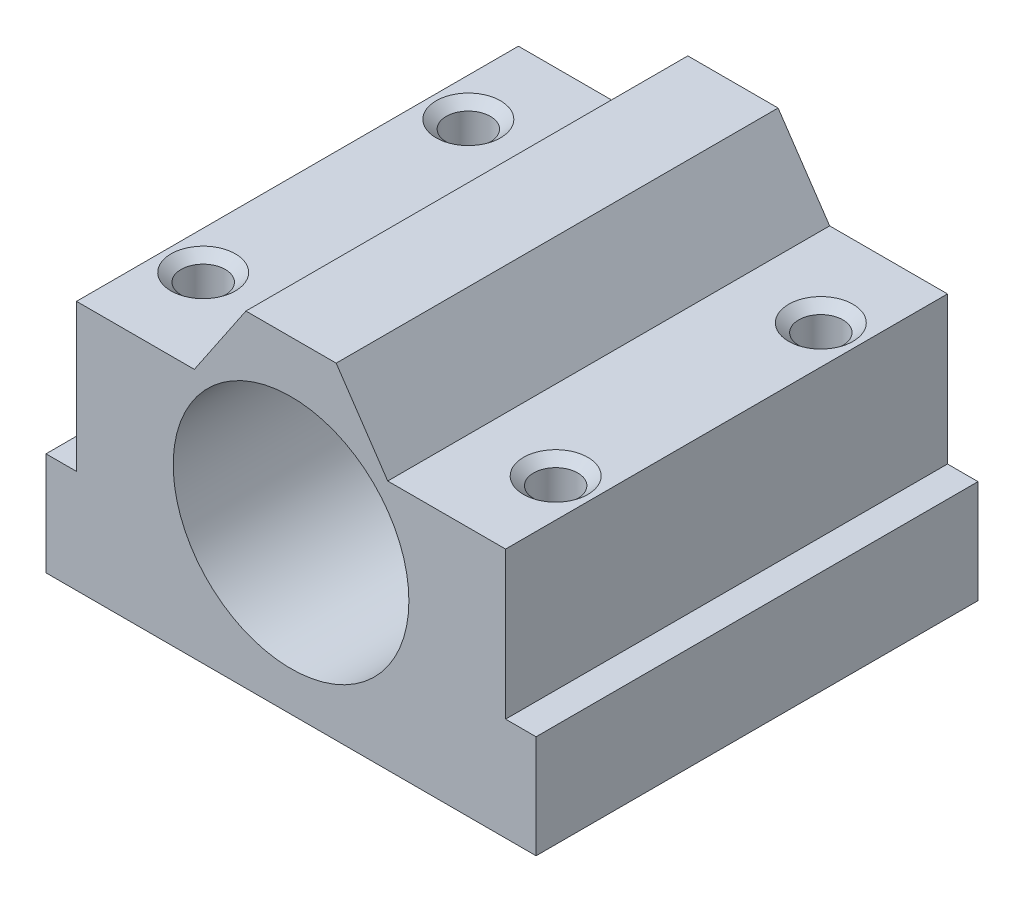
ISO-10303-21;
HEADER;
FILE_DESCRIPTION(('STEP AP214'),'2;1');
FILE_NAME('part.step','',(''),(''),'','','');
FILE_SCHEMA(('AUTOMOTIVE_DESIGN { 1 0 10303 214 1 1 1 1 }'));
ENDSEC;
DATA;
#1=APPLICATION_CONTEXT('core data for automotive mechanical design processes');
#2=APPLICATION_PROTOCOL_DEFINITION('international standard','automotive_design',2000,#1);
#3=PRODUCT_CONTEXT('',#1,'mechanical');
#4=PRODUCT('Part','Part','',(#3));
#5=PRODUCT_RELATED_PRODUCT_CATEGORY('part','',(#4));
#6=PRODUCT_DEFINITION_FORMATION('','',#4);
#7=PRODUCT_DEFINITION_CONTEXT('part definition',#1,'design');
#8=PRODUCT_DEFINITION('design','',#6,#7);
#9=PRODUCT_DEFINITION_SHAPE('','',#8);
#10=(LENGTH_UNIT() NAMED_UNIT(*) SI_UNIT(.MILLI.,.METRE.));
#11=(NAMED_UNIT(*) PLANE_ANGLE_UNIT() SI_UNIT($,.RADIAN.));
#12=(NAMED_UNIT(*) SI_UNIT($,.STERADIAN.) SOLID_ANGLE_UNIT());
#13=UNCERTAINTY_MEASURE_WITH_UNIT(LENGTH_MEASURE(1.E-05),#10,'distance_accuracy_value','');
#14=(GEOMETRIC_REPRESENTATION_CONTEXT(3) GLOBAL_UNCERTAINTY_ASSIGNED_CONTEXT((#13)) GLOBAL_UNIT_ASSIGNED_CONTEXT((#10,
#11,#12)) REPRESENTATION_CONTEXT('',''));
#15=CARTESIAN_POINT('',(0.,0.,0.));
#16=DIRECTION('',(0.,0.,1.));
#17=DIRECTION('',(1.,0.,0.));
#18=AXIS2_PLACEMENT_3D('',#15,#16,#17);
#19=CARTESIAN_POINT('',(0.,0.,30.));
#20=DIRECTION('',(0.,0.,1.));
#21=DIRECTION('',(1.,0.,0.));
#22=AXIS2_PLACEMENT_3D('',#19,#20,#21);
#23=PLANE('',#22);
#24=DIRECTION('',(1.,0.,0.));
#25=VECTOR('',#24,1.);
#26=CARTESIAN_POINT('',(0.,0.,30.));
#27=LINE('',#26,#25);
#28=CARTESIAN_POINT('',(0.,0.,30.));
#29=VERTEX_POINT('',#28);
#30=CARTESIAN_POINT('',(33.27,0.,30.));
#31=VERTEX_POINT('',#30);
#32=EDGE_CURVE('E186',#29,#31,#27,.T.);
#33=ORIENTED_EDGE('',*,*,#32,.T.);
#34=DIRECTION('',(0.,1.,0.));
#35=VECTOR('',#34,1.);
#36=CARTESIAN_POINT('',(33.27,0.,30.));
#37=LINE('',#36,#35);
#38=CARTESIAN_POINT('',(33.27,7.,30.));
#39=VERTEX_POINT('',#38);
#40=EDGE_CURVE('E114',#31,#39,#37,.T.);
#41=ORIENTED_EDGE('',*,*,#40,.T.);
#42=DIRECTION('',(-1.,0.,0.));
#43=VECTOR('',#42,1.);
#44=CARTESIAN_POINT('',(33.27,7.,30.));
#45=LINE('',#44,#43);
#46=CARTESIAN_POINT('',(31.1993641202158,7.,30.));
#47=VERTEX_POINT('',#46);
#48=EDGE_CURVE('E253',#39,#47,#45,.T.);
#49=ORIENTED_EDGE('',*,*,#48,.T.);
#50=DIRECTION('',(0.,1.,0.));
#51=VECTOR('',#50,1.);
#52=CARTESIAN_POINT('',(31.1993641202158,7.,30.));
#53=LINE('',#52,#51);
#54=CARTESIAN_POINT('',(31.1993641202158,17.,30.));
#55=VERTEX_POINT('',#54);
#56=EDGE_CURVE('E255',#47,#55,#53,.T.);
#57=ORIENTED_EDGE('',*,*,#56,.T.);
#58=DIRECTION('',(-1.,0.,0.));
#59=VECTOR('',#58,1.);
#60=CARTESIAN_POINT('',(31.1993641202158,17.,30.));
#61=LINE('',#60,#59);
#62=CARTESIAN_POINT('',(23.1993641202158,17.,30.));
#63=VERTEX_POINT('',#62);
#64=EDGE_CURVE('E257',#55,#63,#61,.T.);
#65=ORIENTED_EDGE('',*,*,#64,.T.);
#66=DIRECTION('',(-0.559857411277987,0.82858896869142,0.));
#67=VECTOR('',#66,1.);
#68=CARTESIAN_POINT('',(23.1993641202158,17.,30.));
#69=LINE('',#68,#67);
#70=CARTESIAN_POINT('',(19.6993641202158,22.18,30.));
#71=VERTEX_POINT('',#70);
#72=EDGE_CURVE('E259',#63,#71,#69,.T.);
#73=ORIENTED_EDGE('',*,*,#72,.T.);
#74=DIRECTION('',(-1.,0.,0.));
#75=VECTOR('',#74,1.);
#76=CARTESIAN_POINT('',(13.5706358797842,22.18,30.));
#77=LINE('',#76,#75);
#78=CARTESIAN_POINT('',(13.5706358797842,22.18,30.));
#79=VERTEX_POINT('',#78);
#80=EDGE_CURVE('E261',#71,#79,#77,.T.);
#81=ORIENTED_EDGE('',*,*,#80,.T.);
#82=DIRECTION('',(-0.559857411277987,-0.82858896869142,0.));
#83=VECTOR('',#82,1.);
#84=CARTESIAN_POINT('',(10.0706358797842,17.,30.));
#85=LINE('',#84,#83);
#86=CARTESIAN_POINT('',(10.0706358797842,17.,30.));
#87=VERTEX_POINT('',#86);
#88=EDGE_CURVE('E263',#79,#87,#85,.T.);
#89=ORIENTED_EDGE('',*,*,#88,.T.);
#90=DIRECTION('',(-1.,0.,0.));
#91=VECTOR('',#90,1.);
#92=CARTESIAN_POINT('',(2.0706358797842,17.,30.));
#93=LINE('',#92,#91);
#94=CARTESIAN_POINT('',(2.0706358797842,17.,30.));
#95=VERTEX_POINT('',#94);
#96=EDGE_CURVE('E145',#87,#95,#93,.T.);
#97=ORIENTED_EDGE('',*,*,#96,.T.);
#98=DIRECTION('',(0.,-1.,0.));
#99=VECTOR('',#98,1.);
#100=CARTESIAN_POINT('',(2.0706358797842,7.,30.));
#101=LINE('',#100,#99);
#102=CARTESIAN_POINT('',(2.0706358797842,7.,30.));
#103=VERTEX_POINT('',#102);
#104=EDGE_CURVE('E139',#95,#103,#101,.T.);
#105=ORIENTED_EDGE('',*,*,#104,.T.);
#106=DIRECTION('',(-1.,0.,0.));
#107=VECTOR('',#106,1.);
#108=CARTESIAN_POINT('',(0.,7.,30.));
#109=LINE('',#108,#107);
#110=CARTESIAN_POINT('',(0.,7.,30.));
#111=VERTEX_POINT('',#110);
#112=EDGE_CURVE('E143',#103,#111,#109,.T.);
#113=ORIENTED_EDGE('',*,*,#112,.T.);
#114=DIRECTION('',(0.,-1.,0.));
#115=VECTOR('',#114,1.);
#116=CARTESIAN_POINT('',(0.,0.,30.));
#117=LINE('',#116,#115);
#118=EDGE_CURVE('E59',#111,#29,#117,.T.);
#119=ORIENTED_EDGE('',*,*,#118,.T.);
#120=EDGE_LOOP('',(#33,#41,#49,#57,#65,#73,#81,#89,#97,#105,#113,#119));
#121=FACE_BOUND('',#120,.T.);
#122=CARTESIAN_POINT('',(16.635,10.68,30.));
#123=DIRECTION('',(0.,0.,1.));
#124=DIRECTION('',(1.,0.,0.));
#125=AXIS2_PLACEMENT_3D('',#122,#123,#124);
#126=CIRCLE('',#125,8.);
#127=CARTESIAN_POINT('',(24.635,10.68,30.));
#128=VERTEX_POINT('',#127);
#129=EDGE_CURVE('E167',#128,#128,#126,.T.);
#130=ORIENTED_EDGE('',*,*,#129,.F.);
#131=EDGE_LOOP('',(#130));
#132=FACE_BOUND('',#131,.T.);
#133=ADVANCED_FACE('F40',(#121,#132),#23,.T.);
#134=CARTESIAN_POINT('',(0.,0.,0.));
#135=DIRECTION('',(0.,0.,1.));
#136=DIRECTION('',(1.,0.,0.));
#137=AXIS2_PLACEMENT_3D('',#134,#135,#136);
#138=PLANE('',#137);
#139=DIRECTION('',(1.,0.,0.));
#140=VECTOR('',#139,1.);
#141=CARTESIAN_POINT('',(0.,0.,0.));
#142=LINE('',#141,#140);
#143=CARTESIAN_POINT('',(0.,0.,0.));
#144=VERTEX_POINT('',#143);
#145=CARTESIAN_POINT('',(33.27,0.,0.));
#146=VERTEX_POINT('',#145);
#147=EDGE_CURVE('E163',#144,#146,#142,.T.);
#148=ORIENTED_EDGE('',*,*,#147,.F.);
#149=DIRECTION('',(0.,-1.,0.));
#150=VECTOR('',#149,1.);
#151=CARTESIAN_POINT('',(0.,0.,0.));
#152=LINE('',#151,#150);
#153=CARTESIAN_POINT('',(0.,7.,0.));
#154=VERTEX_POINT('',#153);
#155=EDGE_CURVE('E106',#154,#144,#152,.T.);
#156=ORIENTED_EDGE('',*,*,#155,.F.);
#157=DIRECTION('',(-1.,0.,0.));
#158=VECTOR('',#157,1.);
#159=CARTESIAN_POINT('',(0.,7.,0.));
#160=LINE('',#159,#158);
#161=CARTESIAN_POINT('',(2.0706358797842,7.,0.));
#162=VERTEX_POINT('',#161);
#163=EDGE_CURVE('E100',#162,#154,#160,.T.);
#164=ORIENTED_EDGE('',*,*,#163,.F.);
#165=DIRECTION('',(0.,-1.,0.));
#166=VECTOR('',#165,1.);
#167=CARTESIAN_POINT('',(2.0706358797842,7.,0.));
#168=LINE('',#167,#166);
#169=CARTESIAN_POINT('',(2.0706358797842,17.,0.));
#170=VERTEX_POINT('',#169);
#171=EDGE_CURVE('E153',#170,#162,#168,.T.);
#172=ORIENTED_EDGE('',*,*,#171,.F.);
#173=DIRECTION('',(-1.,0.,0.));
#174=VECTOR('',#173,1.);
#175=CARTESIAN_POINT('',(2.0706358797842,17.,0.));
#176=LINE('',#175,#174);
#177=CARTESIAN_POINT('',(10.0706358797842,17.,0.));
#178=VERTEX_POINT('',#177);
#179=EDGE_CURVE('E181',#178,#170,#176,.T.);
#180=ORIENTED_EDGE('',*,*,#179,.F.);
#181=DIRECTION('',(-0.559857411277987,-0.82858896869142,0.));
#182=VECTOR('',#181,1.);
#183=CARTESIAN_POINT('',(10.0706358797842,17.,0.));
#184=LINE('',#183,#182);
#185=CARTESIAN_POINT('',(13.5706358797842,22.18,0.));
#186=VERTEX_POINT('',#185);
#187=EDGE_CURVE('E179',#186,#178,#184,.T.);
#188=ORIENTED_EDGE('',*,*,#187,.F.);
#189=DIRECTION('',(-1.,0.,0.));
#190=VECTOR('',#189,1.);
#191=CARTESIAN_POINT('',(13.5706358797842,22.18,0.));
#192=LINE('',#191,#190);
#193=CARTESIAN_POINT('',(19.6993641202158,22.18,0.));
#194=VERTEX_POINT('',#193);
#195=EDGE_CURVE('E177',#194,#186,#192,.T.);
#196=ORIENTED_EDGE('',*,*,#195,.F.);
#197=DIRECTION('',(-0.559857411277987,0.82858896869142,0.));
#198=VECTOR('',#197,1.);
#199=CARTESIAN_POINT('',(23.1993641202158,17.,0.));
#200=LINE('',#199,#198);
#201=CARTESIAN_POINT('',(23.1993641202158,17.,0.));
#202=VERTEX_POINT('',#201);
#203=EDGE_CURVE('E175',#202,#194,#200,.T.);
#204=ORIENTED_EDGE('',*,*,#203,.F.);
#205=DIRECTION('',(-1.,0.,0.));
#206=VECTOR('',#205,1.);
#207=CARTESIAN_POINT('',(31.1993641202158,17.,0.));
#208=LINE('',#207,#206);
#209=CARTESIAN_POINT('',(31.1993641202158,17.,0.));
#210=VERTEX_POINT('',#209);
#211=EDGE_CURVE('E173',#210,#202,#208,.T.);
#212=ORIENTED_EDGE('',*,*,#211,.F.);
#213=DIRECTION('',(0.,1.,0.));
#214=VECTOR('',#213,1.);
#215=CARTESIAN_POINT('',(31.1993641202158,7.,0.));
#216=LINE('',#215,#214);
#217=CARTESIAN_POINT('',(31.1993641202158,7.,0.));
#218=VERTEX_POINT('',#217);
#219=EDGE_CURVE('E171',#218,#210,#216,.T.);
#220=ORIENTED_EDGE('',*,*,#219,.F.);
#221=DIRECTION('',(-1.,0.,0.));
#222=VECTOR('',#221,1.);
#223=CARTESIAN_POINT('',(33.27,7.,0.));
#224=LINE('',#223,#222);
#225=CARTESIAN_POINT('',(33.27,7.,0.));
#226=VERTEX_POINT('',#225);
#227=EDGE_CURVE('E169',#226,#218,#224,.T.);
#228=ORIENTED_EDGE('',*,*,#227,.F.);
#229=DIRECTION('',(0.,1.,0.));
#230=VECTOR('',#229,1.);
#231=CARTESIAN_POINT('',(33.27,0.,0.));
#232=LINE('',#231,#230);
#233=EDGE_CURVE('E166',#146,#226,#232,.T.);
#234=ORIENTED_EDGE('',*,*,#233,.F.);
#235=EDGE_LOOP('',(#148,#156,#164,#172,#180,#188,#196,#204,#212,#220,#228,#234));
#236=FACE_BOUND('',#235,.T.);
#237=CARTESIAN_POINT('',(16.635,10.68,0.));
#238=DIRECTION('',(0.,0.,1.));
#239=DIRECTION('',(1.,0.,0.));
#240=AXIS2_PLACEMENT_3D('',#237,#238,#239);
#241=CIRCLE('',#240,8.);
#242=CARTESIAN_POINT('',(24.635,10.68,0.));
#243=VERTEX_POINT('',#242);
#244=EDGE_CURVE('E246',#243,#243,#241,.T.);
#245=ORIENTED_EDGE('',*,*,#244,.T.);
#246=EDGE_LOOP('',(#245));
#247=FACE_BOUND('',#246,.T.);
#248=ADVANCED_FACE('F276',(#236,#247),#138,.F.);
#249=CARTESIAN_POINT('',(0.,0.,30.));
#250=DIRECTION('',(0.,1.,0.));
#251=DIRECTION('',(0.,0.,1.));
#252=AXIS2_PLACEMENT_3D('',#249,#250,#251);
#253=PLANE('',#252);
#254=CARTESIAN_POINT('',(4.67063587978421,0.,6.));
#255=DIRECTION('',(0.,1.,0.));
#256=DIRECTION('',(0.,0.,1.));
#257=AXIS2_PLACEMENT_3D('',#254,#255,#256);
#258=CIRCLE('',#257,1.5);
#259=CARTESIAN_POINT('',(4.67063587978421,0.,7.5));
#260=VERTEX_POINT('',#259);
#261=EDGE_CURVE('E237',#260,#260,#258,.T.);
#262=ORIENTED_EDGE('',*,*,#261,.T.);
#263=EDGE_LOOP('',(#262));
#264=FACE_BOUND('',#263,.T.);
#265=CARTESIAN_POINT('',(4.67063587978422,0.,24.));
#266=DIRECTION('',(0.,1.,0.));
#267=DIRECTION('',(0.,0.,1.));
#268=AXIS2_PLACEMENT_3D('',#265,#266,#267);
#269=CIRCLE('',#268,1.5);
#270=CARTESIAN_POINT('',(4.67063587978422,0.,25.5));
#271=VERTEX_POINT('',#270);
#272=EDGE_CURVE('E213',#271,#271,#269,.T.);
#273=ORIENTED_EDGE('',*,*,#272,.T.);
#274=EDGE_LOOP('',(#273));
#275=FACE_BOUND('',#274,.T.);
#276=CARTESIAN_POINT('',(28.5993641202158,0.,24.));
#277=DIRECTION('',(0.,1.,0.));
#278=DIRECTION('',(0.,0.,1.));
#279=AXIS2_PLACEMENT_3D('',#276,#277,#278);
#280=CIRCLE('',#279,1.5);
#281=CARTESIAN_POINT('',(28.5993641202158,0.,25.5));
#282=VERTEX_POINT('',#281);
#283=EDGE_CURVE('E243',#282,#282,#280,.T.);
#284=ORIENTED_EDGE('',*,*,#283,.T.);
#285=EDGE_LOOP('',(#284));
#286=FACE_BOUND('',#285,.T.);
#287=CARTESIAN_POINT('',(28.5993641202158,0.,6.));
#288=DIRECTION('',(0.,1.,0.));
#289=DIRECTION('',(0.,0.,1.));
#290=AXIS2_PLACEMENT_3D('',#287,#288,#289);
#291=CIRCLE('',#290,1.5);
#292=CARTESIAN_POINT('',(28.5993641202158,0.,7.5));
#293=VERTEX_POINT('',#292);
#294=EDGE_CURVE('E240',#293,#293,#291,.T.);
#295=ORIENTED_EDGE('',*,*,#294,.T.);
#296=EDGE_LOOP('',(#295));
#297=FACE_BOUND('',#296,.T.);
#298=ORIENTED_EDGE('',*,*,#147,.T.);
#299=DIRECTION('',(0.,0.,-1.));
#300=VECTOR('',#299,1.);
#301=CARTESIAN_POINT('',(33.27,0.,30.));
#302=LINE('',#301,#300);
#303=EDGE_CURVE('E11',#31,#146,#302,.T.);
#304=ORIENTED_EDGE('',*,*,#303,.F.);
#305=ORIENTED_EDGE('',*,*,#32,.F.);
#306=DIRECTION('',(0.,0.,-1.));
#307=VECTOR('',#306,1.);
#308=CARTESIAN_POINT('',(0.,0.,30.));
#309=LINE('',#308,#307);
#310=EDGE_CURVE('E159',#29,#144,#309,.T.);
#311=ORIENTED_EDGE('',*,*,#310,.T.);
#312=EDGE_LOOP('',(#298,#304,#305,#311));
#313=FACE_BOUND('',#312,.T.);
#314=ADVANCED_FACE('F42',(#264,#275,#286,#297,#313),#253,.F.);
#315=CARTESIAN_POINT('',(33.27,0.,30.));
#316=DIRECTION('',(-1.,0.,0.));
#317=DIRECTION('',(0.,0.,1.));
#318=AXIS2_PLACEMENT_3D('',#315,#316,#317);
#319=PLANE('',#318);
#320=ORIENTED_EDGE('',*,*,#233,.T.);
#321=DIRECTION('',(0.,0.,-1.));
#322=VECTOR('',#321,1.);
#323=CARTESIAN_POINT('',(33.27,7.,30.));
#324=LINE('',#323,#322);
#325=EDGE_CURVE('E50',#39,#226,#324,.T.);
#326=ORIENTED_EDGE('',*,*,#325,.F.);
#327=ORIENTED_EDGE('',*,*,#40,.F.);
#328=ORIENTED_EDGE('',*,*,#303,.T.);
#329=EDGE_LOOP('',(#320,#326,#327,#328));
#330=FACE_BOUND('',#329,.T.);
#331=ADVANCED_FACE('F340',(#330),#319,.F.);
#332=CARTESIAN_POINT('',(33.27,7.,30.));
#333=DIRECTION('',(0.,-1.,0.));
#334=DIRECTION('',(0.,0.,-1.));
#335=AXIS2_PLACEMENT_3D('',#332,#333,#334);
#336=PLANE('',#335);
#337=ORIENTED_EDGE('',*,*,#227,.T.);
#338=DIRECTION('',(0.,0.,-1.));
#339=VECTOR('',#338,1.);
#340=CARTESIAN_POINT('',(31.1993641202158,7.,30.));
#341=LINE('',#340,#339);
#342=EDGE_CURVE('E205',#47,#218,#341,.T.);
#343=ORIENTED_EDGE('',*,*,#342,.F.);
#344=ORIENTED_EDGE('',*,*,#48,.F.);
#345=ORIENTED_EDGE('',*,*,#325,.T.);
#346=EDGE_LOOP('',(#337,#343,#344,#345));
#347=FACE_BOUND('',#346,.T.);
#348=ADVANCED_FACE('F347',(#347),#336,.F.);
#349=CARTESIAN_POINT('',(31.1993641202158,7.,30.));
#350=DIRECTION('',(-1.,0.,0.));
#351=DIRECTION('',(0.,0.,1.));
#352=AXIS2_PLACEMENT_3D('',#349,#350,#351);
#353=PLANE('',#352);
#354=ORIENTED_EDGE('',*,*,#219,.T.);
#355=DIRECTION('',(0.,0.,-1.));
#356=VECTOR('',#355,1.);
#357=CARTESIAN_POINT('',(31.1993641202158,17.,30.));
#358=LINE('',#357,#356);
#359=EDGE_CURVE('E202',#55,#210,#358,.T.);
#360=ORIENTED_EDGE('',*,*,#359,.F.);
#361=ORIENTED_EDGE('',*,*,#56,.F.);
#362=ORIENTED_EDGE('',*,*,#342,.T.);
#363=EDGE_LOOP('',(#354,#360,#361,#362));
#364=FACE_BOUND('',#363,.T.);
#365=ADVANCED_FACE('F356',(#364),#353,.F.);
#366=CARTESIAN_POINT('',(31.1993641202158,17.,30.));
#367=DIRECTION('',(0.,-1.,0.));
#368=DIRECTION('',(0.,0.,-1.));
#369=AXIS2_PLACEMENT_3D('',#366,#367,#368);
#370=PLANE('',#369);
#371=CARTESIAN_POINT('',(28.5993641202158,17.,24.));
#372=DIRECTION('',(0.,1.,0.));
#373=DIRECTION('',(0.,0.,1.));
#374=AXIS2_PLACEMENT_3D('',#371,#372,#373);
#375=CIRCLE('',#374,2.1844);
#376=CARTESIAN_POINT('',(28.5993641202158,17.,26.1844));
#377=VERTEX_POINT('',#376);
#378=EDGE_CURVE('E230',#377,#377,#375,.T.);
#379=ORIENTED_EDGE('',*,*,#378,.F.);
#380=EDGE_LOOP('',(#379));
#381=FACE_BOUND('',#380,.T.);
#382=CARTESIAN_POINT('',(28.5993641202158,17.,6.));
#383=DIRECTION('',(0.,1.,0.));
#384=DIRECTION('',(0.,0.,1.));
#385=AXIS2_PLACEMENT_3D('',#382,#383,#384);
#386=CIRCLE('',#385,2.1844);
#387=CARTESIAN_POINT('',(28.5993641202158,17.,8.1844));
#388=VERTEX_POINT('',#387);
#389=EDGE_CURVE('E220',#388,#388,#386,.T.);
#390=ORIENTED_EDGE('',*,*,#389,.F.);
#391=EDGE_LOOP('',(#390));
#392=FACE_BOUND('',#391,.T.);
#393=ORIENTED_EDGE('',*,*,#211,.T.);
#394=DIRECTION('',(0.,0.,-1.));
#395=VECTOR('',#394,1.);
#396=CARTESIAN_POINT('',(23.1993641202158,17.,30.));
#397=LINE('',#396,#395);
#398=EDGE_CURVE('E199',#63,#202,#397,.T.);
#399=ORIENTED_EDGE('',*,*,#398,.F.);
#400=ORIENTED_EDGE('',*,*,#64,.F.);
#401=ORIENTED_EDGE('',*,*,#359,.T.);
#402=EDGE_LOOP('',(#393,#399,#400,#401));
#403=FACE_BOUND('',#402,.T.);
#404=ADVANCED_FACE('F362',(#381,#392,#403),#370,.F.);
#405=CARTESIAN_POINT('',(23.1993641202158,17.,30.));
#406=DIRECTION('',(-0.82858896869142,-0.559857411277987,0.));
#407=DIRECTION('',(0.559857411277987,-0.82858896869142,0.));
#408=AXIS2_PLACEMENT_3D('',#405,#406,#407);
#409=PLANE('',#408);
#410=ORIENTED_EDGE('',*,*,#203,.T.);
#411=DIRECTION('',(0.,0.,-1.));
#412=VECTOR('',#411,1.);
#413=CARTESIAN_POINT('',(19.6993641202158,22.18,30.));
#414=LINE('',#413,#412);
#415=EDGE_CURVE('E196',#71,#194,#414,.T.);
#416=ORIENTED_EDGE('',*,*,#415,.F.);
#417=ORIENTED_EDGE('',*,*,#72,.F.);
#418=ORIENTED_EDGE('',*,*,#398,.T.);
#419=EDGE_LOOP('',(#410,#416,#417,#418));
#420=FACE_BOUND('',#419,.T.);
#421=ADVANCED_FACE('F366',(#420),#409,.F.);
#422=CARTESIAN_POINT('',(13.5706358797842,22.18,30.));
#423=DIRECTION('',(0.,-1.,0.));
#424=DIRECTION('',(0.,0.,-1.));
#425=AXIS2_PLACEMENT_3D('',#422,#423,#424);
#426=PLANE('',#425);
#427=ORIENTED_EDGE('',*,*,#195,.T.);
#428=DIRECTION('',(0.,0.,-1.));
#429=VECTOR('',#428,1.);
#430=CARTESIAN_POINT('',(13.5706358797842,22.18,30.));
#431=LINE('',#430,#429);
#432=EDGE_CURVE('E193',#79,#186,#431,.T.);
#433=ORIENTED_EDGE('',*,*,#432,.F.);
#434=ORIENTED_EDGE('',*,*,#80,.F.);
#435=ORIENTED_EDGE('',*,*,#415,.T.);
#436=EDGE_LOOP('',(#427,#433,#434,#435));
#437=FACE_BOUND('',#436,.T.);
#438=ADVANCED_FACE('F370',(#437),#426,.F.);
#439=CARTESIAN_POINT('',(10.0706358797842,17.,30.));
#440=DIRECTION('',(0.82858896869142,-0.559857411277987,0.));
#441=DIRECTION('',(0.559857411277987,0.82858896869142,0.));
#442=AXIS2_PLACEMENT_3D('',#439,#440,#441);
#443=PLANE('',#442);
#444=ORIENTED_EDGE('',*,*,#187,.T.);
#445=DIRECTION('',(0.,0.,-1.));
#446=VECTOR('',#445,1.);
#447=CARTESIAN_POINT('',(10.0706358797842,17.,30.));
#448=LINE('',#447,#446);
#449=EDGE_CURVE('E190',#87,#178,#448,.T.);
#450=ORIENTED_EDGE('',*,*,#449,.F.);
#451=ORIENTED_EDGE('',*,*,#88,.F.);
#452=ORIENTED_EDGE('',*,*,#432,.T.);
#453=EDGE_LOOP('',(#444,#450,#451,#452));
#454=FACE_BOUND('',#453,.T.);
#455=ADVANCED_FACE('F269',(#454),#443,.F.);
#456=CARTESIAN_POINT('',(2.0706358797842,17.,30.));
#457=DIRECTION('',(0.,-1.,0.));
#458=DIRECTION('',(0.,0.,-1.));
#459=AXIS2_PLACEMENT_3D('',#456,#457,#458);
#460=PLANE('',#459);
#461=CARTESIAN_POINT('',(4.67063587978422,17.,24.));
#462=DIRECTION('',(0.,1.,0.));
#463=DIRECTION('',(0.,0.,1.));
#464=AXIS2_PLACEMENT_3D('',#461,#462,#463);
#465=CIRCLE('',#464,2.1844);
#466=CARTESIAN_POINT('',(4.67063587978422,17.,26.1844));
#467=VERTEX_POINT('',#466);
#468=EDGE_CURVE('E217',#467,#467,#465,.T.);
#469=ORIENTED_EDGE('',*,*,#468,.F.);
#470=EDGE_LOOP('',(#469));
#471=FACE_BOUND('',#470,.T.);
#472=CARTESIAN_POINT('',(4.67063587978421,17.,6.));
#473=DIRECTION('',(0.,1.,0.));
#474=DIRECTION('',(0.,0.,1.));
#475=AXIS2_PLACEMENT_3D('',#472,#473,#474);
#476=CIRCLE('',#475,2.1844);
#477=CARTESIAN_POINT('',(4.67063587978421,17.,8.1844));
#478=VERTEX_POINT('',#477);
#479=EDGE_CURVE('E214',#478,#478,#476,.T.);
#480=ORIENTED_EDGE('',*,*,#479,.F.);
#481=EDGE_LOOP('',(#480));
#482=FACE_BOUND('',#481,.T.);
#483=ORIENTED_EDGE('',*,*,#179,.T.);
#484=DIRECTION('',(0.,0.,-1.));
#485=VECTOR('',#484,1.);
#486=CARTESIAN_POINT('',(2.0706358797842,17.,30.));
#487=LINE('',#486,#485);
#488=EDGE_CURVE('E154',#95,#170,#487,.T.);
#489=ORIENTED_EDGE('',*,*,#488,.F.);
#490=ORIENTED_EDGE('',*,*,#96,.F.);
#491=ORIENTED_EDGE('',*,*,#449,.T.);
#492=EDGE_LOOP('',(#483,#489,#490,#491));
#493=FACE_BOUND('',#492,.T.);
#494=ADVANCED_FACE('F273',(#471,#482,#493),#460,.F.);
#495=CARTESIAN_POINT('',(2.0706358797842,7.,30.));
#496=DIRECTION('',(1.,0.,0.));
#497=DIRECTION('',(0.,0.,-1.));
#498=AXIS2_PLACEMENT_3D('',#495,#496,#497);
#499=PLANE('',#498);
#500=ORIENTED_EDGE('',*,*,#171,.T.);
#501=DIRECTION('',(0.,0.,-1.));
#502=VECTOR('',#501,1.);
#503=CARTESIAN_POINT('',(2.0706358797842,7.,30.));
#504=LINE('',#503,#502);
#505=EDGE_CURVE('E150',#103,#162,#504,.T.);
#506=ORIENTED_EDGE('',*,*,#505,.F.);
#507=ORIENTED_EDGE('',*,*,#104,.F.);
#508=ORIENTED_EDGE('',*,*,#488,.T.);
#509=EDGE_LOOP('',(#500,#506,#507,#508));
#510=FACE_BOUND('',#509,.T.);
#511=ADVANCED_FACE('F151',(#510),#499,.F.);
#512=CARTESIAN_POINT('',(0.,7.,30.));
#513=DIRECTION('',(0.,-1.,0.));
#514=DIRECTION('',(0.,0.,-1.));
#515=AXIS2_PLACEMENT_3D('',#512,#513,#514);
#516=PLANE('',#515);
#517=ORIENTED_EDGE('',*,*,#163,.T.);
#518=DIRECTION('',(0.,0.,-1.));
#519=VECTOR('',#518,1.);
#520=CARTESIAN_POINT('',(0.,7.,30.));
#521=LINE('',#520,#519);
#522=EDGE_CURVE('E155',#111,#154,#521,.T.);
#523=ORIENTED_EDGE('',*,*,#522,.F.);
#524=ORIENTED_EDGE('',*,*,#112,.F.);
#525=ORIENTED_EDGE('',*,*,#505,.T.);
#526=EDGE_LOOP('',(#517,#523,#524,#525));
#527=FACE_BOUND('',#526,.T.);
#528=ADVANCED_FACE('F157',(#527),#516,.F.);
#529=CARTESIAN_POINT('',(0.,0.,30.));
#530=DIRECTION('',(1.,0.,0.));
#531=DIRECTION('',(0.,0.,-1.));
#532=AXIS2_PLACEMENT_3D('',#529,#530,#531);
#533=PLANE('',#532);
#534=ORIENTED_EDGE('',*,*,#155,.T.);
#535=ORIENTED_EDGE('',*,*,#310,.F.);
#536=ORIENTED_EDGE('',*,*,#118,.F.);
#537=ORIENTED_EDGE('',*,*,#522,.T.);
#538=EDGE_LOOP('',(#534,#535,#536,#537));
#539=FACE_BOUND('',#538,.T.);
#540=ADVANCED_FACE('F282',(#539),#533,.F.);
#541=CARTESIAN_POINT('',(16.635,10.68,30.));
#542=DIRECTION('',(0.,0.,-1.));
#543=DIRECTION('',(-1.,0.,0.));
#544=AXIS2_PLACEMENT_3D('',#541,#542,#543);
#545=CYLINDRICAL_SURFACE('',#544,8.);
#546=ORIENTED_EDGE('',*,*,#129,.T.);
#547=EDGE_LOOP('',(#546));
#548=FACE_BOUND('',#547,.T.);
#549=ORIENTED_EDGE('',*,*,#244,.F.);
#550=EDGE_LOOP('',(#549));
#551=FACE_BOUND('',#550,.T.);
#552=ADVANCED_FACE('F284',(#548,#551),#545,.F.);
#553=CARTESIAN_POINT('',(4.67063587978422,-13.,24.));
#554=DIRECTION('',(0.,1.,0.));
#555=DIRECTION('',(0.,0.,1.));
#556=AXIS2_PLACEMENT_3D('',#553,#554,#555);
#557=CYLINDRICAL_SURFACE('',#556,1.5);
#558=CARTESIAN_POINT('',(4.67063587978422,16.4257202124223,24.));
#559=DIRECTION('',(0.,1.,0.));
#560=DIRECTION('',(0.,0.,1.));
#561=AXIS2_PLACEMENT_3D('',#558,#559,#560);
#562=CIRCLE('',#561,1.5);
#563=CARTESIAN_POINT('',(4.67063587978422,16.4257202124223,25.5));
#564=VERTEX_POINT('',#563);
#565=EDGE_CURVE('E215',#564,#564,#562,.T.);
#566=ORIENTED_EDGE('',*,*,#565,.T.);
#567=EDGE_LOOP('',(#566));
#568=FACE_BOUND('',#567,.T.);
#569=ORIENTED_EDGE('',*,*,#272,.F.);
#570=EDGE_LOOP('',(#569));
#571=FACE_BOUND('',#570,.T.);
#572=ADVANCED_FACE('F290',(#568,#571),#557,.F.);
#573=CARTESIAN_POINT('',(4.67063587978421,-13.,6.));
#574=DIRECTION('',(0.,1.,0.));
#575=DIRECTION('',(0.,0.,1.));
#576=AXIS2_PLACEMENT_3D('',#573,#574,#575);
#577=CYLINDRICAL_SURFACE('',#576,1.5);
#578=CARTESIAN_POINT('',(4.67063587978421,16.4257202124223,6.));
#579=DIRECTION('',(0.,1.,0.));
#580=DIRECTION('',(0.,0.,1.));
#581=AXIS2_PLACEMENT_3D('',#578,#579,#580);
#582=CIRCLE('',#581,1.5);
#583=CARTESIAN_POINT('',(4.67063587978421,16.4257202124223,7.5));
#584=VERTEX_POINT('',#583);
#585=EDGE_CURVE('E210',#584,#584,#582,.T.);
#586=ORIENTED_EDGE('',*,*,#585,.T.);
#587=EDGE_LOOP('',(#586));
#588=FACE_BOUND('',#587,.T.);
#589=ORIENTED_EDGE('',*,*,#261,.F.);
#590=EDGE_LOOP('',(#589));
#591=FACE_BOUND('',#590,.T.);
#592=ADVANCED_FACE('F305',(#588,#591),#577,.F.);
#593=CARTESIAN_POINT('',(28.5993641202158,-13.,6.));
#594=DIRECTION('',(0.,1.,0.));
#595=DIRECTION('',(0.,0.,1.));
#596=AXIS2_PLACEMENT_3D('',#593,#594,#595);
#597=CYLINDRICAL_SURFACE('',#596,1.5);
#598=CARTESIAN_POINT('',(28.5993641202158,16.4257202124223,6.));
#599=DIRECTION('',(0.,1.,0.));
#600=DIRECTION('',(0.,0.,1.));
#601=AXIS2_PLACEMENT_3D('',#598,#599,#600);
#602=CIRCLE('',#601,1.5);
#603=CARTESIAN_POINT('',(28.5993641202158,16.4257202124223,7.5));
#604=VERTEX_POINT('',#603);
#605=EDGE_CURVE('E218',#604,#604,#602,.T.);
#606=ORIENTED_EDGE('',*,*,#605,.T.);
#607=EDGE_LOOP('',(#606));
#608=FACE_BOUND('',#607,.T.);
#609=ORIENTED_EDGE('',*,*,#294,.F.);
#610=EDGE_LOOP('',(#609));
#611=FACE_BOUND('',#610,.T.);
#612=ADVANCED_FACE('F301',(#608,#611),#597,.F.);
#613=CARTESIAN_POINT('',(28.5993641202158,-13.,24.));
#614=DIRECTION('',(0.,1.,0.));
#615=DIRECTION('',(0.,0.,1.));
#616=AXIS2_PLACEMENT_3D('',#613,#614,#615);
#617=CYLINDRICAL_SURFACE('',#616,1.5);
#618=CARTESIAN_POINT('',(28.5993641202158,16.4257202124223,24.));
#619=DIRECTION('',(0.,1.,0.));
#620=DIRECTION('',(0.,0.,1.));
#621=AXIS2_PLACEMENT_3D('',#618,#619,#620);
#622=CIRCLE('',#621,1.5);
#623=CARTESIAN_POINT('',(28.5993641202158,16.4257202124223,25.5));
#624=VERTEX_POINT('',#623);
#625=EDGE_CURVE('E44',#624,#624,#622,.T.);
#626=ORIENTED_EDGE('',*,*,#625,.T.);
#627=EDGE_LOOP('',(#626));
#628=FACE_BOUND('',#627,.T.);
#629=ORIENTED_EDGE('',*,*,#283,.F.);
#630=EDGE_LOOP('',(#629));
#631=FACE_BOUND('',#630,.T.);
#632=ADVANCED_FACE('F304',(#628,#631),#617,.F.);
#633=CARTESIAN_POINT('',(4.67063587978421,17.,6.));
#634=DIRECTION('',(0.,1.,0.));
#635=DIRECTION('',(0.,0.,1.));
#636=AXIS2_PLACEMENT_3D('',#633,#634,#635);
#637=CONICAL_SURFACE('',#636,2.1844,0.872664625997164);
#638=ORIENTED_EDGE('',*,*,#479,.T.);
#639=EDGE_LOOP('',(#638));
#640=FACE_BOUND('',#639,.T.);
#641=ORIENTED_EDGE('',*,*,#585,.F.);
#642=EDGE_LOOP('',(#641));
#643=FACE_BOUND('',#642,.T.);
#644=ADVANCED_FACE('F314',(#640,#643),#637,.F.);
#645=CARTESIAN_POINT('',(4.67063587978422,17.,24.));
#646=DIRECTION('',(0.,1.,0.));
#647=DIRECTION('',(0.,0.,1.));
#648=AXIS2_PLACEMENT_3D('',#645,#646,#647);
#649=CONICAL_SURFACE('',#648,2.1844,0.872664625997178);
#650=ORIENTED_EDGE('',*,*,#468,.T.);
#651=EDGE_LOOP('',(#650));
#652=FACE_BOUND('',#651,.T.);
#653=ORIENTED_EDGE('',*,*,#565,.F.);
#654=EDGE_LOOP('',(#653));
#655=FACE_BOUND('',#654,.T.);
#656=ADVANCED_FACE('F318',(#652,#655),#649,.F.);
#657=CARTESIAN_POINT('',(28.5993641202158,17.,6.));
#658=DIRECTION('',(0.,1.,0.));
#659=DIRECTION('',(0.,0.,1.));
#660=AXIS2_PLACEMENT_3D('',#657,#658,#659);
#661=CONICAL_SURFACE('',#660,2.1844,0.872664625997178);
#662=ORIENTED_EDGE('',*,*,#389,.T.);
#663=EDGE_LOOP('',(#662));
#664=FACE_BOUND('',#663,.T.);
#665=ORIENTED_EDGE('',*,*,#605,.F.);
#666=EDGE_LOOP('',(#665));
#667=FACE_BOUND('',#666,.T.);
#668=ADVANCED_FACE('F322',(#664,#667),#661,.F.);
#669=CARTESIAN_POINT('',(28.5993641202158,17.,24.));
#670=DIRECTION('',(0.,1.,0.));
#671=DIRECTION('',(0.,0.,1.));
#672=AXIS2_PLACEMENT_3D('',#669,#670,#671);
#673=CONICAL_SURFACE('',#672,2.1844,0.872664625997178);
#674=ORIENTED_EDGE('',*,*,#378,.T.);
#675=EDGE_LOOP('',(#674));
#676=FACE_BOUND('',#675,.T.);
#677=ORIENTED_EDGE('',*,*,#625,.F.);
#678=EDGE_LOOP('',(#677));
#679=FACE_BOUND('',#678,.T.);
#680=ADVANCED_FACE('F326',(#676,#679),#673,.F.);
#681=CLOSED_SHELL('',(#133,#248,#314,#331,#348,#365,#404,#421,#438,#455,#494,#511,#528,#540,
#552,#572,#592,#612,#632,#644,#656,#668,#680));
#682=MANIFOLD_SOLID_BREP('B2',#681);
#683=ADVANCED_BREP_SHAPE_REPRESENTATION('',(#18,#682),#14);
#684=SHAPE_DEFINITION_REPRESENTATION(#9,#683);
ENDSEC;
END-ISO-10303-21;
